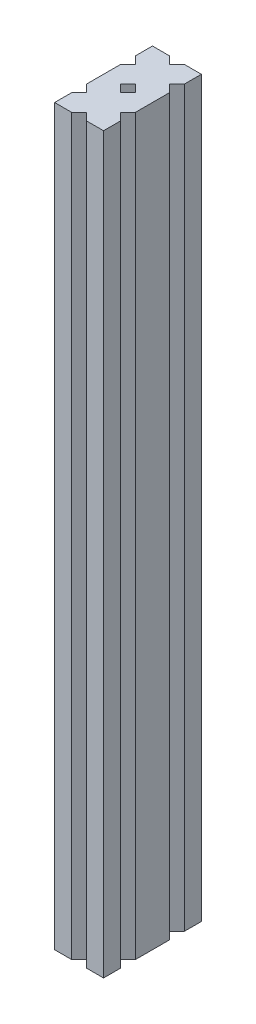
ISO-10303-21;
HEADER;
FILE_DESCRIPTION(('STEP AP214'),'2;1');
FILE_NAME('part.step','',(''),(''),'','','');
FILE_SCHEMA(('AUTOMOTIVE_DESIGN { 1 0 10303 214 1 1 1 1 }'));
ENDSEC;
DATA;
#1=APPLICATION_CONTEXT('core data for automotive mechanical design processes');
#2=APPLICATION_PROTOCOL_DEFINITION('international standard','automotive_design',2000,#1);
#3=PRODUCT_CONTEXT('',#1,'mechanical');
#4=PRODUCT('Part','Part','',(#3));
#5=PRODUCT_RELATED_PRODUCT_CATEGORY('part','',(#4));
#6=PRODUCT_DEFINITION_FORMATION('','',#4);
#7=PRODUCT_DEFINITION_CONTEXT('part definition',#1,'design');
#8=PRODUCT_DEFINITION('design','',#6,#7);
#9=PRODUCT_DEFINITION_SHAPE('','',#8);
#10=(LENGTH_UNIT() NAMED_UNIT(*) SI_UNIT(.MILLI.,.METRE.));
#11=(NAMED_UNIT(*) PLANE_ANGLE_UNIT() SI_UNIT($,.RADIAN.));
#12=(NAMED_UNIT(*) SI_UNIT($,.STERADIAN.) SOLID_ANGLE_UNIT());
#13=UNCERTAINTY_MEASURE_WITH_UNIT(LENGTH_MEASURE(1.E-05),#10,'distance_accuracy_value','');
#14=(GEOMETRIC_REPRESENTATION_CONTEXT(3) GLOBAL_UNCERTAINTY_ASSIGNED_CONTEXT((#13)) GLOBAL_UNIT_ASSIGNED_CONTEXT((#10,
#11,#12)) REPRESENTATION_CONTEXT('',''));
#15=CARTESIAN_POINT('',(0.,0.,0.));
#16=DIRECTION('',(0.,0.,1.));
#17=DIRECTION('',(1.,0.,0.));
#18=AXIS2_PLACEMENT_3D('',#15,#16,#17);
#19=CARTESIAN_POINT('',(20.,300.,0.));
#20=DIRECTION('',(0.,0.,-1.));
#21=DIRECTION('',(-1.,0.,0.));
#22=AXIS2_PLACEMENT_3D('',#19,#20,#21);
#23=PLANE('',#22);
#24=DIRECTION('',(0.,1.,0.));
#25=VECTOR('',#24,1.);
#26=CARTESIAN_POINT('',(7.,0.,0.));
#27=LINE('',#26,#25);
#28=CARTESIAN_POINT('',(7.,0.,0.));
#29=VERTEX_POINT('',#28);
#30=CARTESIAN_POINT('',(7.,300.,0.));
#31=VERTEX_POINT('',#30);
#32=EDGE_CURVE('E332',#29,#31,#27,.T.);
#33=ORIENTED_EDGE('',*,*,#32,.T.);
#34=DIRECTION('',(1.,0.,0.));
#35=VECTOR('',#34,1.);
#36=CARTESIAN_POINT('',(20.,300.,0.));
#37=LINE('',#36,#35);
#38=CARTESIAN_POINT('',(0.,300.,0.));
#39=VERTEX_POINT('',#38);
#40=EDGE_CURVE('E261',#39,#31,#37,.T.);
#41=ORIENTED_EDGE('',*,*,#40,.F.);
#42=DIRECTION('',(0.,-1.,0.));
#43=VECTOR('',#42,1.);
#44=CARTESIAN_POINT('',(0.,300.,0.));
#45=LINE('',#44,#43);
#46=CARTESIAN_POINT('',(0.,0.,0.));
#47=VERTEX_POINT('',#46);
#48=EDGE_CURVE('E287',#39,#47,#45,.T.);
#49=ORIENTED_EDGE('',*,*,#48,.T.);
#50=DIRECTION('',(1.,0.,0.));
#51=VECTOR('',#50,1.);
#52=CARTESIAN_POINT('',(20.,0.,0.));
#53=LINE('',#52,#51);
#54=EDGE_CURVE('E235',#47,#29,#53,.T.);
#55=ORIENTED_EDGE('',*,*,#54,.T.);
#56=EDGE_LOOP('',(#33,#41,#49,#55));
#57=FACE_BOUND('',#56,.T.);
#58=ADVANCED_FACE('F34',(#57),#23,.F.);
#59=CARTESIAN_POINT('',(20.,300.,-40.));
#60=DIRECTION('',(-1.,0.,0.));
#61=DIRECTION('',(0.,0.,1.));
#62=AXIS2_PLACEMENT_3D('',#59,#60,#61);
#63=PLANE('',#62);
#64=DIRECTION('',(0.,1.,0.));
#65=VECTOR('',#64,1.);
#66=CARTESIAN_POINT('',(20.,0.,-27.));
#67=LINE('',#66,#65);
#68=CARTESIAN_POINT('',(20.,0.,-27.));
#69=VERTEX_POINT('',#68);
#70=CARTESIAN_POINT('',(20.,300.,-27.));
#71=VERTEX_POINT('',#70);
#72=EDGE_CURVE('E351',#69,#71,#67,.T.);
#73=ORIENTED_EDGE('',*,*,#72,.T.);
#74=DIRECTION('',(0.,0.,-1.));
#75=VECTOR('',#74,1.);
#76=CARTESIAN_POINT('',(20.,300.,-40.));
#77=LINE('',#76,#75);
#78=CARTESIAN_POINT('',(20.,300.,-13.));
#79=VERTEX_POINT('',#78);
#80=EDGE_CURVE('E280',#79,#71,#77,.T.);
#81=ORIENTED_EDGE('',*,*,#80,.F.);
#82=DIRECTION('',(0.,1.,0.));
#83=VECTOR('',#82,1.);
#84=CARTESIAN_POINT('',(20.,0.,-13.));
#85=LINE('',#84,#83);
#86=CARTESIAN_POINT('',(20.,0.,-13.));
#87=VERTEX_POINT('',#86);
#88=EDGE_CURVE('E414',#87,#79,#85,.T.);
#89=ORIENTED_EDGE('',*,*,#88,.F.);
#90=DIRECTION('',(0.,0.,-1.));
#91=VECTOR('',#90,1.);
#92=CARTESIAN_POINT('',(20.,0.,-40.));
#93=LINE('',#92,#91);
#94=EDGE_CURVE('E296',#87,#69,#93,.T.);
#95=ORIENTED_EDGE('',*,*,#94,.T.);
#96=EDGE_LOOP('',(#73,#81,#89,#95));
#97=FACE_BOUND('',#96,.T.);
#98=ADVANCED_FACE('F502',(#97),#63,.F.);
#99=DIRECTION('',(0.,1.,0.));
#100=VECTOR('',#99,1.);
#101=CARTESIAN_POINT('',(20.,0.,-7.00000000000001));
#102=LINE('',#101,#100);
#103=CARTESIAN_POINT('',(20.,0.,-7.00000000000001));
#104=VERTEX_POINT('',#103);
#105=CARTESIAN_POINT('',(20.,300.,-7.00000000000001));
#106=VERTEX_POINT('',#105);
#107=EDGE_CURVE('E404',#104,#106,#102,.T.);
#108=ORIENTED_EDGE('',*,*,#107,.T.);
#109=CARTESIAN_POINT('',(20.,300.,0.));
#110=VERTEX_POINT('',#109);
#111=EDGE_CURVE('E277',#110,#106,#77,.T.);
#112=ORIENTED_EDGE('',*,*,#111,.F.);
#113=DIRECTION('',(0.,-1.,0.));
#114=VECTOR('',#113,1.);
#115=CARTESIAN_POINT('',(20.,300.,0.));
#116=LINE('',#115,#114);
#117=CARTESIAN_POINT('',(20.,0.,0.));
#118=VERTEX_POINT('',#117);
#119=EDGE_CURVE('E11',#110,#118,#116,.T.);
#120=ORIENTED_EDGE('',*,*,#119,.T.);
#121=EDGE_CURVE('E293',#118,#104,#93,.T.);
#122=ORIENTED_EDGE('',*,*,#121,.T.);
#123=EDGE_LOOP('',(#108,#112,#120,#122));
#124=FACE_BOUND('',#123,.T.);
#125=ADVANCED_FACE('F702',(#124),#63,.F.);
#126=CARTESIAN_POINT('',(0.,300.,-40.));
#127=DIRECTION('',(0.,0.,1.));
#128=DIRECTION('',(1.,0.,0.));
#129=AXIS2_PLACEMENT_3D('',#126,#127,#128);
#130=PLANE('',#129);
#131=DIRECTION('',(0.,1.,0.));
#132=VECTOR('',#131,1.);
#133=CARTESIAN_POINT('',(13.,0.,-40.));
#134=LINE('',#133,#132);
#135=CARTESIAN_POINT('',(13.,0.,-40.));
#136=VERTEX_POINT('',#135);
#137=CARTESIAN_POINT('',(13.,300.,-40.));
#138=VERTEX_POINT('',#137);
#139=EDGE_CURVE('E327',#136,#138,#134,.T.);
#140=ORIENTED_EDGE('',*,*,#139,.T.);
#141=DIRECTION('',(-1.,0.,0.));
#142=VECTOR('',#141,1.);
#143=CARTESIAN_POINT('',(0.,300.,-40.));
#144=LINE('',#143,#142);
#145=CARTESIAN_POINT('',(20.,300.,-40.));
#146=VERTEX_POINT('',#145);
#147=EDGE_CURVE('E281',#146,#138,#144,.T.);
#148=ORIENTED_EDGE('',*,*,#147,.F.);
#149=DIRECTION('',(0.,-1.,0.));
#150=VECTOR('',#149,1.);
#151=CARTESIAN_POINT('',(20.,300.,-40.));
#152=LINE('',#151,#150);
#153=CARTESIAN_POINT('',(20.,0.,-40.));
#154=VERTEX_POINT('',#153);
#155=EDGE_CURVE('E43',#146,#154,#152,.T.);
#156=ORIENTED_EDGE('',*,*,#155,.T.);
#157=DIRECTION('',(-1.,0.,0.));
#158=VECTOR('',#157,1.);
#159=CARTESIAN_POINT('',(0.,0.,-40.));
#160=LINE('',#159,#158);
#161=EDGE_CURVE('E238',#154,#136,#160,.T.);
#162=ORIENTED_EDGE('',*,*,#161,.T.);
#163=EDGE_LOOP('',(#140,#148,#156,#162));
#164=FACE_BOUND('',#163,.T.);
#165=ADVANCED_FACE('F317',(#164),#130,.F.);
#166=CARTESIAN_POINT('',(0.,300.,0.));
#167=DIRECTION('',(1.,0.,0.));
#168=DIRECTION('',(0.,0.,-1.));
#169=AXIS2_PLACEMENT_3D('',#166,#167,#168);
#170=PLANE('',#169);
#171=DIRECTION('',(0.,1.,0.));
#172=VECTOR('',#171,1.);
#173=CARTESIAN_POINT('',(0.,0.,-13.));
#174=LINE('',#173,#172);
#175=CARTESIAN_POINT('',(0.,0.,-13.));
#176=VERTEX_POINT('',#175);
#177=CARTESIAN_POINT('',(0.,300.,-13.));
#178=VERTEX_POINT('',#177);
#179=EDGE_CURVE('E409',#176,#178,#174,.T.);
#180=ORIENTED_EDGE('',*,*,#179,.T.);
#181=DIRECTION('',(0.,0.,1.));
#182=VECTOR('',#181,1.);
#183=CARTESIAN_POINT('',(0.,300.,0.));
#184=LINE('',#183,#182);
#185=CARTESIAN_POINT('',(0.,300.,-27.));
#186=VERTEX_POINT('',#185);
#187=EDGE_CURVE('E288',#186,#178,#184,.T.);
#188=ORIENTED_EDGE('',*,*,#187,.F.);
#189=DIRECTION('',(0.,1.,0.));
#190=VECTOR('',#189,1.);
#191=CARTESIAN_POINT('',(0.,0.,-27.));
#192=LINE('',#191,#190);
#193=CARTESIAN_POINT('',(0.,0.,-27.));
#194=VERTEX_POINT('',#193);
#195=EDGE_CURVE('E432',#194,#186,#192,.T.);
#196=ORIENTED_EDGE('',*,*,#195,.F.);
#197=DIRECTION('',(0.,0.,1.));
#198=VECTOR('',#197,1.);
#199=CARTESIAN_POINT('',(0.,0.,0.));
#200=LINE('',#199,#198);
#201=EDGE_CURVE('E237',#194,#176,#200,.T.);
#202=ORIENTED_EDGE('',*,*,#201,.T.);
#203=EDGE_LOOP('',(#180,#188,#196,#202));
#204=FACE_BOUND('',#203,.T.);
#205=ADVANCED_FACE('F467',(#204),#170,.F.);
#206=DIRECTION('',(0.,1.,0.));
#207=VECTOR('',#206,1.);
#208=CARTESIAN_POINT('',(0.,0.,-33.));
#209=LINE('',#208,#207);
#210=CARTESIAN_POINT('',(0.,0.,-33.));
#211=VERTEX_POINT('',#210);
#212=CARTESIAN_POINT('',(0.,300.,-33.));
#213=VERTEX_POINT('',#212);
#214=EDGE_CURVE('E275',#211,#213,#209,.T.);
#215=ORIENTED_EDGE('',*,*,#214,.T.);
#216=CARTESIAN_POINT('',(0.,300.,-40.));
#217=VERTEX_POINT('',#216);
#218=EDGE_CURVE('E284',#217,#213,#184,.T.);
#219=ORIENTED_EDGE('',*,*,#218,.F.);
#220=DIRECTION('',(0.,-1.,0.));
#221=VECTOR('',#220,1.);
#222=CARTESIAN_POINT('',(0.,300.,-40.));
#223=LINE('',#222,#221);
#224=CARTESIAN_POINT('',(0.,0.,-40.));
#225=VERTEX_POINT('',#224);
#226=EDGE_CURVE('E319',#217,#225,#223,.T.);
#227=ORIENTED_EDGE('',*,*,#226,.T.);
#228=EDGE_CURVE('E240',#225,#211,#200,.T.);
#229=ORIENTED_EDGE('',*,*,#228,.T.);
#230=EDGE_LOOP('',(#215,#219,#227,#229));
#231=FACE_BOUND('',#230,.T.);
#232=ADVANCED_FACE('F441',(#231),#170,.F.);
#233=CARTESIAN_POINT('',(0.,300.,0.));
#234=DIRECTION('',(0.,-1.,0.));
#235=DIRECTION('',(0.,0.,-1.));
#236=AXIS2_PLACEMENT_3D('',#233,#234,#235);
#237=PLANE('',#236);
#238=DIRECTION('',(-0.707106781186549,0.,0.707106781186546));
#239=VECTOR('',#238,1.);
#240=CARTESIAN_POINT('',(-3.50000000000002,300.,-3.50000000000004));
#241=LINE('',#240,#239);
#242=CARTESIAN_POINT('',(13.,300.,-20.));
#243=VERTEX_POINT('',#242);
#244=CARTESIAN_POINT('',(10.,300.,-17.));
#245=VERTEX_POINT('',#244);
#246=EDGE_CURVE('E50',#243,#245,#241,.T.);
#247=ORIENTED_EDGE('',*,*,#246,.T.);
#248=DIRECTION('',(0.707106781186548,0.,0.707106781186547));
#249=VECTOR('',#248,1.);
#250=CARTESIAN_POINT('',(13.5,300.,-13.5));
#251=LINE('',#250,#249);
#252=CARTESIAN_POINT('',(7.,300.,-20.));
#253=VERTEX_POINT('',#252);
#254=EDGE_CURVE('E367',#253,#245,#251,.T.);
#255=ORIENTED_EDGE('',*,*,#254,.F.);
#256=DIRECTION('',(0.707106781186546,0.,-0.707106781186549));
#257=VECTOR('',#256,1.);
#258=CARTESIAN_POINT('',(-6.49999999999998,300.,-6.49999999999994));
#259=LINE('',#258,#257);
#260=CARTESIAN_POINT('',(10.,300.,-23.));
#261=VERTEX_POINT('',#260);
#262=EDGE_CURVE('E382',#253,#261,#259,.T.);
#263=ORIENTED_EDGE('',*,*,#262,.T.);
#264=DIRECTION('',(-0.707106781186546,0.,-0.707106781186549));
#265=VECTOR('',#264,1.);
#266=CARTESIAN_POINT('',(16.5,300.,-16.5));
#267=LINE('',#266,#265);
#268=EDGE_CURVE('E378',#243,#261,#267,.T.);
#269=ORIENTED_EDGE('',*,*,#268,.F.);
#270=EDGE_LOOP('',(#247,#255,#263,#269));
#271=FACE_BOUND('',#270,.T.);
#272=DIRECTION('',(-0.707106781186547,0.,0.707106781186548));
#273=VECTOR('',#272,1.);
#274=CARTESIAN_POINT('',(-13.5,300.,-13.5));
#275=LINE('',#274,#273);
#276=CARTESIAN_POINT('',(10.,300.,-37.));
#277=VERTEX_POINT('',#276);
#278=EDGE_CURVE('E329',#138,#277,#275,.T.);
#279=ORIENTED_EDGE('',*,*,#278,.T.);
#280=DIRECTION('',(0.707106781186547,0.,0.707106781186548));
#281=VECTOR('',#280,1.);
#282=CARTESIAN_POINT('',(23.5,300.,-23.5));
#283=LINE('',#282,#281);
#284=CARTESIAN_POINT('',(6.99999999999999,300.,-40.));
#285=VERTEX_POINT('',#284);
#286=EDGE_CURVE('E325',#285,#277,#283,.T.);
#287=ORIENTED_EDGE('',*,*,#286,.F.);
#288=EDGE_CURVE('E279',#285,#217,#144,.T.);
#289=ORIENTED_EDGE('',*,*,#288,.T.);
#290=ORIENTED_EDGE('',*,*,#218,.T.);
#291=DIRECTION('',(0.707106781186549,0.,0.707106781186546));
#292=VECTOR('',#291,1.);
#293=CARTESIAN_POINT('',(16.5,300.,-16.5));
#294=LINE('',#293,#292);
#295=CARTESIAN_POINT('',(3.,300.,-30.));
#296=VERTEX_POINT('',#295);
#297=EDGE_CURVE('E339',#213,#296,#294,.T.);
#298=ORIENTED_EDGE('',*,*,#297,.T.);
#299=DIRECTION('',(0.707106781186548,0.,-0.707106781186547));
#300=VECTOR('',#299,1.);
#301=CARTESIAN_POINT('',(-13.5,300.,-13.5));
#302=LINE('',#301,#300);
#303=EDGE_CURVE('E423',#186,#296,#302,.T.);
#304=ORIENTED_EDGE('',*,*,#303,.F.);
#305=ORIENTED_EDGE('',*,*,#187,.T.);
#306=DIRECTION('',(0.707106781186548,0.,0.707106781186547));
#307=VECTOR('',#306,1.);
#308=CARTESIAN_POINT('',(6.5,300.,-6.5));
#309=LINE('',#308,#307);
#310=CARTESIAN_POINT('',(3.,300.,-10.));
#311=VERTEX_POINT('',#310);
#312=EDGE_CURVE('E219',#178,#311,#309,.T.);
#313=ORIENTED_EDGE('',*,*,#312,.T.);
#314=DIRECTION('',(0.707106781186549,0.,-0.707106781186546));
#315=VECTOR('',#314,1.);
#316=CARTESIAN_POINT('',(-3.5,300.,-3.50000000000001));
#317=LINE('',#316,#315);
#318=CARTESIAN_POINT('',(0.,300.,-7.));
#319=VERTEX_POINT('',#318);
#320=EDGE_CURVE('E461',#319,#311,#317,.T.);
#321=ORIENTED_EDGE('',*,*,#320,.F.);
#322=EDGE_CURVE('E227',#319,#39,#184,.T.);
#323=ORIENTED_EDGE('',*,*,#322,.T.);
#324=ORIENTED_EDGE('',*,*,#40,.T.);
#325=DIRECTION('',(0.707106781186547,0.,-0.707106781186548));
#326=VECTOR('',#325,1.);
#327=CARTESIAN_POINT('',(3.5,300.,3.5));
#328=LINE('',#327,#326);
#329=CARTESIAN_POINT('',(10.,300.,-3.));
#330=VERTEX_POINT('',#329);
#331=EDGE_CURVE('E459',#31,#330,#328,.T.);
#332=ORIENTED_EDGE('',*,*,#331,.T.);
#333=DIRECTION('',(-0.707106781186547,0.,-0.707106781186548));
#334=VECTOR('',#333,1.);
#335=CARTESIAN_POINT('',(6.50000000000001,300.,-6.5));
#336=LINE('',#335,#334);
#337=CARTESIAN_POINT('',(13.,300.,0.));
#338=VERTEX_POINT('',#337);
#339=EDGE_CURVE('E482',#338,#330,#336,.T.);
#340=ORIENTED_EDGE('',*,*,#339,.F.);
#341=EDGE_CURVE('E252',#338,#110,#37,.T.);
#342=ORIENTED_EDGE('',*,*,#341,.T.);
#343=ORIENTED_EDGE('',*,*,#111,.T.);
#344=DIRECTION('',(-0.707106781186548,0.,-0.707106781186547));
#345=VECTOR('',#344,1.);
#346=CARTESIAN_POINT('',(13.5,300.,-13.5));
#347=LINE('',#346,#345);
#348=CARTESIAN_POINT('',(17.,300.,-10.));
#349=VERTEX_POINT('',#348);
#350=EDGE_CURVE('E405',#106,#349,#347,.T.);
#351=ORIENTED_EDGE('',*,*,#350,.T.);
#352=DIRECTION('',(-0.707106781186548,0.,0.707106781186547));
#353=VECTOR('',#352,1.);
#354=CARTESIAN_POINT('',(3.49999999999998,300.,3.49999999999999));
#355=LINE('',#354,#353);
#356=EDGE_CURVE('E401',#79,#349,#355,.T.);
#357=ORIENTED_EDGE('',*,*,#356,.F.);
#358=ORIENTED_EDGE('',*,*,#80,.T.);
#359=DIRECTION('',(-0.707106781186548,0.,-0.707106781186547));
#360=VECTOR('',#359,1.);
#361=CARTESIAN_POINT('',(23.5,300.,-23.5));
#362=LINE('',#361,#360);
#363=CARTESIAN_POINT('',(17.,300.,-30.));
#364=VERTEX_POINT('',#363);
#365=EDGE_CURVE('E352',#71,#364,#362,.T.);
#366=ORIENTED_EDGE('',*,*,#365,.T.);
#367=DIRECTION('',(-0.707106781186548,0.,0.707106781186547));
#368=VECTOR('',#367,1.);
#369=CARTESIAN_POINT('',(-6.50000000000002,300.,-6.50000000000004));
#370=LINE('',#369,#368);
#371=CARTESIAN_POINT('',(20.,300.,-33.));
#372=VERTEX_POINT('',#371);
#373=EDGE_CURVE('E349',#372,#364,#370,.T.);
#374=ORIENTED_EDGE('',*,*,#373,.F.);
#375=EDGE_CURVE('E272',#372,#146,#77,.T.);
#376=ORIENTED_EDGE('',*,*,#375,.T.);
#377=ORIENTED_EDGE('',*,*,#147,.T.);
#378=EDGE_LOOP('',(#279,#287,#289,#290,#298,#304,#305,#313,#321,#323,#324,#332,#340,#342,#343,
#351,#357,#358,#366,#374,#376,#377));
#379=FACE_BOUND('',#378,.T.);
#380=ADVANCED_FACE('F444',(#271,#379),#237,.F.);
#381=CARTESIAN_POINT('',(0.,0.,0.));
#382=DIRECTION('',(0.,-1.,0.));
#383=DIRECTION('',(0.,0.,-1.));
#384=AXIS2_PLACEMENT_3D('',#381,#382,#383);
#385=PLANE('',#384);
#386=DIRECTION('',(0.707106781186548,0.,0.707106781186547));
#387=VECTOR('',#386,1.);
#388=CARTESIAN_POINT('',(13.5,0.,-13.5));
#389=LINE('',#388,#387);
#390=CARTESIAN_POINT('',(7.,0.,-20.));
#391=VERTEX_POINT('',#390);
#392=CARTESIAN_POINT('',(10.,0.,-17.));
#393=VERTEX_POINT('',#392);
#394=EDGE_CURVE('E373',#391,#393,#389,.T.);
#395=ORIENTED_EDGE('',*,*,#394,.T.);
#396=DIRECTION('',(-0.707106781186549,0.,0.707106781186546));
#397=VECTOR('',#396,1.);
#398=CARTESIAN_POINT('',(-3.50000000000002,0.,-3.50000000000004));
#399=LINE('',#398,#397);
#400=CARTESIAN_POINT('',(13.,0.,-20.));
#401=VERTEX_POINT('',#400);
#402=EDGE_CURVE('E364',#401,#393,#399,.T.);
#403=ORIENTED_EDGE('',*,*,#402,.F.);
#404=DIRECTION('',(-0.707106781186546,0.,-0.707106781186549));
#405=VECTOR('',#404,1.);
#406=CARTESIAN_POINT('',(16.5,0.,-16.5));
#407=LINE('',#406,#405);
#408=CARTESIAN_POINT('',(10.,0.,-23.));
#409=VERTEX_POINT('',#408);
#410=EDGE_CURVE('E366',#401,#409,#407,.T.);
#411=ORIENTED_EDGE('',*,*,#410,.T.);
#412=DIRECTION('',(0.707106781186546,0.,-0.707106781186549));
#413=VECTOR('',#412,1.);
#414=CARTESIAN_POINT('',(-6.49999999999998,0.,-6.49999999999994));
#415=LINE('',#414,#413);
#416=EDGE_CURVE('E370',#391,#409,#415,.T.);
#417=ORIENTED_EDGE('',*,*,#416,.F.);
#418=EDGE_LOOP('',(#395,#403,#411,#417));
#419=FACE_BOUND('',#418,.T.);
#420=DIRECTION('',(0.707106781186547,0.,0.707106781186548));
#421=VECTOR('',#420,1.);
#422=CARTESIAN_POINT('',(23.5,0.,-23.5));
#423=LINE('',#422,#421);
#424=CARTESIAN_POINT('',(6.99999999999999,0.,-40.));
#425=VERTEX_POINT('',#424);
#426=CARTESIAN_POINT('',(10.,0.,-37.));
#427=VERTEX_POINT('',#426);
#428=EDGE_CURVE('E323',#425,#427,#423,.T.);
#429=ORIENTED_EDGE('',*,*,#428,.T.);
#430=DIRECTION('',(-0.707106781186547,0.,0.707106781186548));
#431=VECTOR('',#430,1.);
#432=CARTESIAN_POINT('',(-13.5,0.,-13.5));
#433=LINE('',#432,#431);
#434=EDGE_CURVE('E321',#136,#427,#433,.T.);
#435=ORIENTED_EDGE('',*,*,#434,.F.);
#436=ORIENTED_EDGE('',*,*,#161,.F.);
#437=CARTESIAN_POINT('',(20.,0.,-33.));
#438=VERTEX_POINT('',#437);
#439=EDGE_CURVE('E291',#438,#154,#93,.T.);
#440=ORIENTED_EDGE('',*,*,#439,.F.);
#441=DIRECTION('',(-0.707106781186548,0.,0.707106781186547));
#442=VECTOR('',#441,1.);
#443=CARTESIAN_POINT('',(-6.50000000000002,0.,-6.50000000000004));
#444=LINE('',#443,#442);
#445=CARTESIAN_POINT('',(17.,0.,-30.));
#446=VERTEX_POINT('',#445);
#447=EDGE_CURVE('E348',#438,#446,#444,.T.);
#448=ORIENTED_EDGE('',*,*,#447,.T.);
#449=DIRECTION('',(-0.707106781186548,0.,-0.707106781186547));
#450=VECTOR('',#449,1.);
#451=CARTESIAN_POINT('',(23.5,0.,-23.5));
#452=LINE('',#451,#450);
#453=EDGE_CURVE('E345',#69,#446,#452,.T.);
#454=ORIENTED_EDGE('',*,*,#453,.F.);
#455=ORIENTED_EDGE('',*,*,#94,.F.);
#456=DIRECTION('',(-0.707106781186548,0.,0.707106781186547));
#457=VECTOR('',#456,1.);
#458=CARTESIAN_POINT('',(3.49999999999998,0.,3.49999999999999));
#459=LINE('',#458,#457);
#460=CARTESIAN_POINT('',(17.,0.,-10.));
#461=VERTEX_POINT('',#460);
#462=EDGE_CURVE('E400',#87,#461,#459,.T.);
#463=ORIENTED_EDGE('',*,*,#462,.T.);
#464=DIRECTION('',(-0.707106781186548,0.,-0.707106781186547));
#465=VECTOR('',#464,1.);
#466=CARTESIAN_POINT('',(13.5,0.,-13.5));
#467=LINE('',#466,#465);
#468=EDGE_CURVE('E397',#104,#461,#467,.T.);
#469=ORIENTED_EDGE('',*,*,#468,.F.);
#470=ORIENTED_EDGE('',*,*,#121,.F.);
#471=CARTESIAN_POINT('',(13.,0.,0.));
#472=VERTEX_POINT('',#471);
#473=EDGE_CURVE('E292',#472,#118,#53,.T.);
#474=ORIENTED_EDGE('',*,*,#473,.F.);
#475=DIRECTION('',(-0.707106781186547,0.,-0.707106781186548));
#476=VECTOR('',#475,1.);
#477=CARTESIAN_POINT('',(6.50000000000001,0.,-6.5));
#478=LINE('',#477,#476);
#479=CARTESIAN_POINT('',(10.,0.,-3.));
#480=VERTEX_POINT('',#479);
#481=EDGE_CURVE('E481',#472,#480,#478,.T.);
#482=ORIENTED_EDGE('',*,*,#481,.T.);
#483=DIRECTION('',(0.707106781186547,0.,-0.707106781186548));
#484=VECTOR('',#483,1.);
#485=CARTESIAN_POINT('',(3.5,0.,3.5));
#486=LINE('',#485,#484);
#487=EDGE_CURVE('E477',#29,#480,#486,.T.);
#488=ORIENTED_EDGE('',*,*,#487,.F.);
#489=ORIENTED_EDGE('',*,*,#54,.F.);
#490=CARTESIAN_POINT('',(0.,0.,-7.));
#491=VERTEX_POINT('',#490);
#492=EDGE_CURVE('E225',#491,#47,#200,.T.);
#493=ORIENTED_EDGE('',*,*,#492,.F.);
#494=DIRECTION('',(0.707106781186549,0.,-0.707106781186546));
#495=VECTOR('',#494,1.);
#496=CARTESIAN_POINT('',(-3.5,0.,-3.50000000000001));
#497=LINE('',#496,#495);
#498=CARTESIAN_POINT('',(3.,0.,-9.99999999999999));
#499=VERTEX_POINT('',#498);
#500=EDGE_CURVE('E207',#491,#499,#497,.T.);
#501=ORIENTED_EDGE('',*,*,#500,.T.);
#502=DIRECTION('',(0.707106781186548,0.,0.707106781186547));
#503=VECTOR('',#502,1.);
#504=CARTESIAN_POINT('',(6.5,0.,-6.5));
#505=LINE('',#504,#503);
#506=EDGE_CURVE('E218',#176,#499,#505,.T.);
#507=ORIENTED_EDGE('',*,*,#506,.F.);
#508=ORIENTED_EDGE('',*,*,#201,.F.);
#509=DIRECTION('',(0.707106781186548,0.,-0.707106781186547));
#510=VECTOR('',#509,1.);
#511=CARTESIAN_POINT('',(-13.5,0.,-13.5));
#512=LINE('',#511,#510);
#513=CARTESIAN_POINT('',(3.,0.,-30.));
#514=VERTEX_POINT('',#513);
#515=EDGE_CURVE('E422',#194,#514,#512,.T.);
#516=ORIENTED_EDGE('',*,*,#515,.T.);
#517=DIRECTION('',(0.707106781186549,0.,0.707106781186546));
#518=VECTOR('',#517,1.);
#519=CARTESIAN_POINT('',(16.5,0.,-16.5));
#520=LINE('',#519,#518);
#521=EDGE_CURVE('E419',#211,#514,#520,.T.);
#522=ORIENTED_EDGE('',*,*,#521,.F.);
#523=ORIENTED_EDGE('',*,*,#228,.F.);
#524=EDGE_CURVE('E247',#425,#225,#160,.T.);
#525=ORIENTED_EDGE('',*,*,#524,.F.);
#526=EDGE_LOOP('',(#429,#435,#436,#440,#448,#454,#455,#463,#469,#470,#474,#482,#488,#489,#493,
#501,#507,#508,#516,#522,#523,#525));
#527=FACE_BOUND('',#526,.T.);
#528=ADVANCED_FACE('F232',(#419,#527),#385,.T.);
#529=ORIENTED_EDGE('',*,*,#341,.F.);
#530=DIRECTION('',(0.,1.,0.));
#531=VECTOR('',#530,1.);
#532=CARTESIAN_POINT('',(13.,0.,0.));
#533=LINE('',#532,#531);
#534=EDGE_CURVE('E490',#472,#338,#533,.T.);
#535=ORIENTED_EDGE('',*,*,#534,.F.);
#536=ORIENTED_EDGE('',*,*,#473,.T.);
#537=ORIENTED_EDGE('',*,*,#119,.F.);
#538=EDGE_LOOP('',(#529,#535,#536,#537));
#539=FACE_BOUND('',#538,.T.);
#540=ADVANCED_FACE('F36',(#539),#23,.F.);
#541=ORIENTED_EDGE('',*,*,#375,.F.);
#542=DIRECTION('',(0.,1.,0.));
#543=VECTOR('',#542,1.);
#544=CARTESIAN_POINT('',(20.,0.,-33.));
#545=LINE('',#544,#543);
#546=EDGE_CURVE('E312',#438,#372,#545,.T.);
#547=ORIENTED_EDGE('',*,*,#546,.F.);
#548=ORIENTED_EDGE('',*,*,#439,.T.);
#549=ORIENTED_EDGE('',*,*,#155,.F.);
#550=EDGE_LOOP('',(#541,#547,#548,#549));
#551=FACE_BOUND('',#550,.T.);
#552=ADVANCED_FACE('F310',(#551),#63,.F.);
#553=ORIENTED_EDGE('',*,*,#288,.F.);
#554=DIRECTION('',(0.,1.,0.));
#555=VECTOR('',#554,1.);
#556=CARTESIAN_POINT('',(6.99999999999999,0.,-40.));
#557=LINE('',#556,#555);
#558=EDGE_CURVE('E340',#425,#285,#557,.T.);
#559=ORIENTED_EDGE('',*,*,#558,.F.);
#560=ORIENTED_EDGE('',*,*,#524,.T.);
#561=ORIENTED_EDGE('',*,*,#226,.F.);
#562=EDGE_LOOP('',(#553,#559,#560,#561));
#563=FACE_BOUND('',#562,.T.);
#564=ADVANCED_FACE('F450',(#563),#130,.F.);
#565=ORIENTED_EDGE('',*,*,#322,.F.);
#566=DIRECTION('',(0.,1.,0.));
#567=VECTOR('',#566,1.);
#568=CARTESIAN_POINT('',(0.,0.,-7.));
#569=LINE('',#568,#567);
#570=EDGE_CURVE('E211',#491,#319,#569,.T.);
#571=ORIENTED_EDGE('',*,*,#570,.F.);
#572=ORIENTED_EDGE('',*,*,#492,.T.);
#573=ORIENTED_EDGE('',*,*,#48,.F.);
#574=EDGE_LOOP('',(#565,#571,#572,#573));
#575=FACE_BOUND('',#574,.T.);
#576=ADVANCED_FACE('F223',(#575),#170,.F.);
#577=CARTESIAN_POINT('',(16.5,0.,-16.5));
#578=DIRECTION('',(-0.707106781186546,0.,0.707106781186549));
#579=DIRECTION('',(0.707106781186549,0.,0.707106781186546));
#580=AXIS2_PLACEMENT_3D('',#577,#578,#579);
#581=PLANE('',#580);
#582=ORIENTED_EDGE('',*,*,#297,.F.);
#583=ORIENTED_EDGE('',*,*,#214,.F.);
#584=ORIENTED_EDGE('',*,*,#521,.T.);
#585=DIRECTION('',(0.,1.,0.));
#586=VECTOR('',#585,1.);
#587=CARTESIAN_POINT('',(3.,0.,-30.));
#588=LINE('',#587,#586);
#589=EDGE_CURVE('E430',#514,#296,#588,.T.);
#590=ORIENTED_EDGE('',*,*,#589,.T.);
#591=EDGE_LOOP('',(#582,#583,#584,#590));
#592=FACE_BOUND('',#591,.T.);
#593=ADVANCED_FACE('F515',(#592),#581,.T.);
#594=CARTESIAN_POINT('',(-13.5,0.,-13.5));
#595=DIRECTION('',(0.707106781186547,0.,0.707106781186548));
#596=DIRECTION('',(0.707106781186548,0.,-0.707106781186547));
#597=AXIS2_PLACEMENT_3D('',#594,#595,#596);
#598=PLANE('',#597);
#599=ORIENTED_EDGE('',*,*,#303,.T.);
#600=ORIENTED_EDGE('',*,*,#589,.F.);
#601=ORIENTED_EDGE('',*,*,#515,.F.);
#602=ORIENTED_EDGE('',*,*,#195,.T.);
#603=EDGE_LOOP('',(#599,#600,#601,#602));
#604=FACE_BOUND('',#603,.T.);
#605=ADVANCED_FACE('F680',(#604),#598,.F.);
#606=CARTESIAN_POINT('',(3.5,0.,3.5));
#607=DIRECTION('',(0.707106781186548,0.,0.707106781186547));
#608=DIRECTION('',(0.707106781186547,0.,-0.707106781186548));
#609=AXIS2_PLACEMENT_3D('',#606,#607,#608);
#610=PLANE('',#609);
#611=ORIENTED_EDGE('',*,*,#331,.F.);
#612=ORIENTED_EDGE('',*,*,#32,.F.);
#613=ORIENTED_EDGE('',*,*,#487,.T.);
#614=DIRECTION('',(0.,1.,0.));
#615=VECTOR('',#614,1.);
#616=CARTESIAN_POINT('',(10.,0.,-3.));
#617=LINE('',#616,#615);
#618=EDGE_CURVE('E488',#480,#330,#617,.T.);
#619=ORIENTED_EDGE('',*,*,#618,.T.);
#620=EDGE_LOOP('',(#611,#612,#613,#619));
#621=FACE_BOUND('',#620,.T.);
#622=ADVANCED_FACE('F672',(#621),#610,.T.);
#623=CARTESIAN_POINT('',(6.50000000000001,0.,-6.5));
#624=DIRECTION('',(0.707106781186548,0.,-0.707106781186547));
#625=DIRECTION('',(-0.707106781186547,0.,-0.707106781186548));
#626=AXIS2_PLACEMENT_3D('',#623,#624,#625);
#627=PLANE('',#626);
#628=ORIENTED_EDGE('',*,*,#339,.T.);
#629=ORIENTED_EDGE('',*,*,#618,.F.);
#630=ORIENTED_EDGE('',*,*,#481,.F.);
#631=ORIENTED_EDGE('',*,*,#534,.T.);
#632=EDGE_LOOP('',(#628,#629,#630,#631));
#633=FACE_BOUND('',#632,.T.);
#634=ADVANCED_FACE('F665',(#633),#627,.F.);
#635=CARTESIAN_POINT('',(6.5,0.,-6.5));
#636=DIRECTION('',(-0.707106781186547,0.,0.707106781186548));
#637=DIRECTION('',(0.707106781186548,0.,0.707106781186547));
#638=AXIS2_PLACEMENT_3D('',#635,#636,#637);
#639=PLANE('',#638);
#640=ORIENTED_EDGE('',*,*,#312,.F.);
#641=ORIENTED_EDGE('',*,*,#179,.F.);
#642=ORIENTED_EDGE('',*,*,#506,.T.);
#643=DIRECTION('',(0.,1.,0.));
#644=VECTOR('',#643,1.);
#645=CARTESIAN_POINT('',(3.,0.,-10.));
#646=LINE('',#645,#644);
#647=EDGE_CURVE('E213',#499,#311,#646,.T.);
#648=ORIENTED_EDGE('',*,*,#647,.T.);
#649=EDGE_LOOP('',(#640,#641,#642,#648));
#650=FACE_BOUND('',#649,.T.);
#651=ADVANCED_FACE('F528',(#650),#639,.T.);
#652=CARTESIAN_POINT('',(-3.5,0.,-3.50000000000001));
#653=DIRECTION('',(0.707106781186546,0.,0.707106781186549));
#654=DIRECTION('',(0.707106781186549,0.,-0.707106781186546));
#655=AXIS2_PLACEMENT_3D('',#652,#653,#654);
#656=PLANE('',#655);
#657=ORIENTED_EDGE('',*,*,#320,.T.);
#658=ORIENTED_EDGE('',*,*,#647,.F.);
#659=ORIENTED_EDGE('',*,*,#500,.F.);
#660=ORIENTED_EDGE('',*,*,#570,.T.);
#661=EDGE_LOOP('',(#657,#658,#659,#660));
#662=FACE_BOUND('',#661,.T.);
#663=ADVANCED_FACE('F210',(#662),#656,.F.);
#664=CARTESIAN_POINT('',(13.5,0.,-13.5));
#665=DIRECTION('',(0.707106781186547,0.,-0.707106781186548));
#666=DIRECTION('',(-0.707106781186548,0.,-0.707106781186547));
#667=AXIS2_PLACEMENT_3D('',#664,#665,#666);
#668=PLANE('',#667);
#669=ORIENTED_EDGE('',*,*,#350,.F.);
#670=ORIENTED_EDGE('',*,*,#107,.F.);
#671=ORIENTED_EDGE('',*,*,#468,.T.);
#672=DIRECTION('',(0.,1.,0.));
#673=VECTOR('',#672,1.);
#674=CARTESIAN_POINT('',(17.,0.,-10.));
#675=LINE('',#674,#673);
#676=EDGE_CURVE('E379',#461,#349,#675,.T.);
#677=ORIENTED_EDGE('',*,*,#676,.T.);
#678=EDGE_LOOP('',(#669,#670,#671,#677));
#679=FACE_BOUND('',#678,.T.);
#680=ADVANCED_FACE('F527',(#679),#668,.T.);
#681=CARTESIAN_POINT('',(3.49999999999998,0.,3.49999999999999));
#682=DIRECTION('',(-0.707106781186547,0.,-0.707106781186548));
#683=DIRECTION('',(-0.707106781186548,0.,0.707106781186547));
#684=AXIS2_PLACEMENT_3D('',#681,#682,#683);
#685=PLANE('',#684);
#686=ORIENTED_EDGE('',*,*,#356,.T.);
#687=ORIENTED_EDGE('',*,*,#676,.F.);
#688=ORIENTED_EDGE('',*,*,#462,.F.);
#689=ORIENTED_EDGE('',*,*,#88,.T.);
#690=EDGE_LOOP('',(#686,#687,#688,#689));
#691=FACE_BOUND('',#690,.T.);
#692=ADVANCED_FACE('F544',(#691),#685,.F.);
#693=CARTESIAN_POINT('',(-3.50000000000002,0.,-3.50000000000004));
#694=DIRECTION('',(-0.707106781186546,0.,-0.707106781186549));
#695=DIRECTION('',(-0.707106781186549,0.,0.707106781186546));
#696=AXIS2_PLACEMENT_3D('',#693,#694,#695);
#697=PLANE('',#696);
#698=ORIENTED_EDGE('',*,*,#246,.F.);
#699=DIRECTION('',(0.,1.,0.));
#700=VECTOR('',#699,1.);
#701=CARTESIAN_POINT('',(13.,0.,-20.));
#702=LINE('',#701,#700);
#703=EDGE_CURVE('E376',#401,#243,#702,.T.);
#704=ORIENTED_EDGE('',*,*,#703,.F.);
#705=ORIENTED_EDGE('',*,*,#402,.T.);
#706=DIRECTION('',(0.,1.,0.));
#707=VECTOR('',#706,1.);
#708=CARTESIAN_POINT('',(10.,0.,-17.));
#709=LINE('',#708,#707);
#710=EDGE_CURVE('E355',#393,#245,#709,.T.);
#711=ORIENTED_EDGE('',*,*,#710,.T.);
#712=EDGE_LOOP('',(#698,#704,#705,#711));
#713=FACE_BOUND('',#712,.T.);
#714=ADVANCED_FACE('F552',(#713),#697,.T.);
#715=CARTESIAN_POINT('',(13.5,0.,-13.5));
#716=DIRECTION('',(-0.707106781186547,0.,0.707106781186548));
#717=DIRECTION('',(0.707106781186548,0.,0.707106781186547));
#718=AXIS2_PLACEMENT_3D('',#715,#716,#717);
#719=PLANE('',#718);
#720=ORIENTED_EDGE('',*,*,#254,.T.);
#721=ORIENTED_EDGE('',*,*,#710,.F.);
#722=ORIENTED_EDGE('',*,*,#394,.F.);
#723=DIRECTION('',(0.,1.,0.));
#724=VECTOR('',#723,1.);
#725=CARTESIAN_POINT('',(7.,0.,-20.));
#726=LINE('',#725,#724);
#727=EDGE_CURVE('E389',#391,#253,#726,.T.);
#728=ORIENTED_EDGE('',*,*,#727,.T.);
#729=EDGE_LOOP('',(#720,#721,#722,#728));
#730=FACE_BOUND('',#729,.T.);
#731=ADVANCED_FACE('F561',(#730),#719,.F.);
#732=CARTESIAN_POINT('',(-6.49999999999998,0.,-6.49999999999994));
#733=DIRECTION('',(0.707106781186549,0.,0.707106781186546));
#734=DIRECTION('',(0.707106781186546,0.,-0.707106781186549));
#735=AXIS2_PLACEMENT_3D('',#732,#733,#734);
#736=PLANE('',#735);
#737=ORIENTED_EDGE('',*,*,#262,.F.);
#738=ORIENTED_EDGE('',*,*,#727,.F.);
#739=ORIENTED_EDGE('',*,*,#416,.T.);
#740=DIRECTION('',(0.,1.,0.));
#741=VECTOR('',#740,1.);
#742=CARTESIAN_POINT('',(10.,0.,-23.));
#743=LINE('',#742,#741);
#744=EDGE_CURVE('E392',#409,#261,#743,.T.);
#745=ORIENTED_EDGE('',*,*,#744,.T.);
#746=EDGE_LOOP('',(#737,#738,#739,#745));
#747=FACE_BOUND('',#746,.T.);
#748=ADVANCED_FACE('F569',(#747),#736,.T.);
#749=CARTESIAN_POINT('',(16.5,0.,-16.5));
#750=DIRECTION('',(0.707106781186549,0.,-0.707106781186546));
#751=DIRECTION('',(-0.707106781186546,0.,-0.707106781186549));
#752=AXIS2_PLACEMENT_3D('',#749,#750,#751);
#753=PLANE('',#752);
#754=ORIENTED_EDGE('',*,*,#268,.T.);
#755=ORIENTED_EDGE('',*,*,#744,.F.);
#756=ORIENTED_EDGE('',*,*,#410,.F.);
#757=ORIENTED_EDGE('',*,*,#703,.T.);
#758=EDGE_LOOP('',(#754,#755,#756,#757));
#759=FACE_BOUND('',#758,.T.);
#760=ADVANCED_FACE('F577',(#759),#753,.F.);
#761=CARTESIAN_POINT('',(23.5,0.,-23.5));
#762=DIRECTION('',(0.707106781186547,0.,-0.707106781186548));
#763=DIRECTION('',(-0.707106781186548,0.,-0.707106781186547));
#764=AXIS2_PLACEMENT_3D('',#761,#762,#763);
#765=PLANE('',#764);
#766=ORIENTED_EDGE('',*,*,#365,.F.);
#767=ORIENTED_EDGE('',*,*,#72,.F.);
#768=ORIENTED_EDGE('',*,*,#453,.T.);
#769=DIRECTION('',(0.,1.,0.));
#770=VECTOR('',#769,1.);
#771=CARTESIAN_POINT('',(17.,0.,-30.));
#772=LINE('',#771,#770);
#773=EDGE_CURVE('E336',#446,#364,#772,.T.);
#774=ORIENTED_EDGE('',*,*,#773,.T.);
#775=EDGE_LOOP('',(#766,#767,#768,#774));
#776=FACE_BOUND('',#775,.T.);
#777=ADVANCED_FACE('F584',(#776),#765,.T.);
#778=CARTESIAN_POINT('',(-6.50000000000002,0.,-6.50000000000004));
#779=DIRECTION('',(-0.707106781186547,0.,-0.707106781186548));
#780=DIRECTION('',(-0.707106781186548,0.,0.707106781186547));
#781=AXIS2_PLACEMENT_3D('',#778,#779,#780);
#782=PLANE('',#781);
#783=ORIENTED_EDGE('',*,*,#373,.T.);
#784=ORIENTED_EDGE('',*,*,#773,.F.);
#785=ORIENTED_EDGE('',*,*,#447,.F.);
#786=ORIENTED_EDGE('',*,*,#546,.T.);
#787=EDGE_LOOP('',(#783,#784,#785,#786));
#788=FACE_BOUND('',#787,.T.);
#789=ADVANCED_FACE('F593',(#788),#782,.F.);
#790=CARTESIAN_POINT('',(-13.5,0.,-13.5));
#791=DIRECTION('',(-0.707106781186548,0.,-0.707106781186547));
#792=DIRECTION('',(-0.707106781186547,0.,0.707106781186548));
#793=AXIS2_PLACEMENT_3D('',#790,#791,#792);
#794=PLANE('',#793);
#795=ORIENTED_EDGE('',*,*,#278,.F.);
#796=ORIENTED_EDGE('',*,*,#139,.F.);
#797=ORIENTED_EDGE('',*,*,#434,.T.);
#798=DIRECTION('',(0.,1.,0.));
#799=VECTOR('',#798,1.);
#800=CARTESIAN_POINT('',(10.,0.,-37.));
#801=LINE('',#800,#799);
#802=EDGE_CURVE('E58',#427,#277,#801,.T.);
#803=ORIENTED_EDGE('',*,*,#802,.T.);
#804=EDGE_LOOP('',(#795,#796,#797,#803));
#805=FACE_BOUND('',#804,.T.);
#806=ADVANCED_FACE('F602',(#805),#794,.T.);
#807=CARTESIAN_POINT('',(23.5,0.,-23.5));
#808=DIRECTION('',(-0.707106781186548,0.,0.707106781186547));
#809=DIRECTION('',(0.707106781186547,0.,0.707106781186548));
#810=AXIS2_PLACEMENT_3D('',#807,#808,#809);
#811=PLANE('',#810);
#812=ORIENTED_EDGE('',*,*,#286,.T.);
#813=ORIENTED_EDGE('',*,*,#802,.F.);
#814=ORIENTED_EDGE('',*,*,#428,.F.);
#815=ORIENTED_EDGE('',*,*,#558,.T.);
#816=EDGE_LOOP('',(#812,#813,#814,#815));
#817=FACE_BOUND('',#816,.T.);
#818=ADVANCED_FACE('F611',(#817),#811,.F.);
#819=CLOSED_SHELL('',(#58,#98,#125,#165,#205,#232,#380,#528,#540,#552,#564,#576,#593,#605,#622,
#634,#651,#663,#680,#692,#714,#731,#748,#760,#777,#789,#806,#818));
#820=MANIFOLD_SOLID_BREP('B2',#819);
#821=ADVANCED_BREP_SHAPE_REPRESENTATION('',(#18,#820),#14);
#822=SHAPE_DEFINITION_REPRESENTATION(#9,#821);
ENDSEC;
END-ISO-10303-21;
